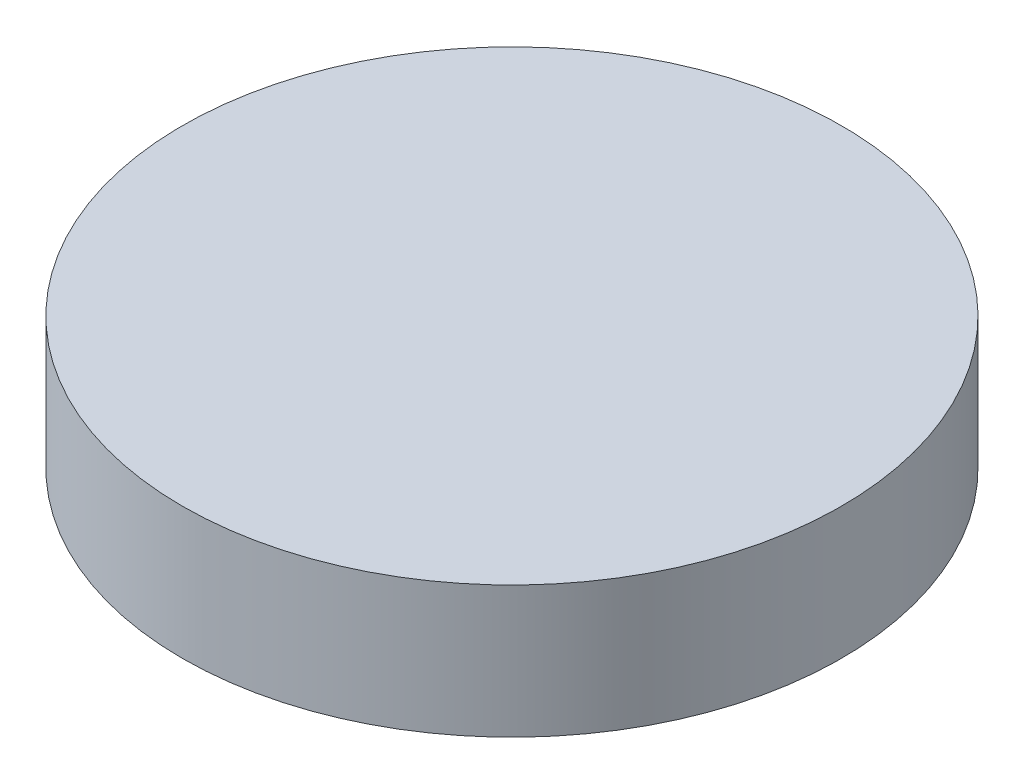
ISO-10303-21;
HEADER;
FILE_DESCRIPTION(('STEP AP214'),'2;1');
FILE_NAME('part.step','',(''),(''),'','','');
FILE_SCHEMA(('AUTOMOTIVE_DESIGN { 1 0 10303 214 1 1 1 1 }'));
ENDSEC;
DATA;
#1=APPLICATION_CONTEXT('core data for automotive mechanical design processes');
#2=APPLICATION_PROTOCOL_DEFINITION('international standard','automotive_design',2000,#1);
#3=PRODUCT_CONTEXT('',#1,'mechanical');
#4=PRODUCT('Part','Part','',(#3));
#5=PRODUCT_RELATED_PRODUCT_CATEGORY('part','',(#4));
#6=PRODUCT_DEFINITION_FORMATION('','',#4);
#7=PRODUCT_DEFINITION_CONTEXT('part definition',#1,'design');
#8=PRODUCT_DEFINITION('design','',#6,#7);
#9=PRODUCT_DEFINITION_SHAPE('','',#8);
#10=(LENGTH_UNIT() NAMED_UNIT(*) SI_UNIT(.MILLI.,.METRE.));
#11=(NAMED_UNIT(*) PLANE_ANGLE_UNIT() SI_UNIT($,.RADIAN.));
#12=(NAMED_UNIT(*) SI_UNIT($,.STERADIAN.) SOLID_ANGLE_UNIT());
#13=UNCERTAINTY_MEASURE_WITH_UNIT(LENGTH_MEASURE(1.E-05),#10,'distance_accuracy_value','');
#14=(GEOMETRIC_REPRESENTATION_CONTEXT(3) GLOBAL_UNCERTAINTY_ASSIGNED_CONTEXT((#13)) GLOBAL_UNIT_ASSIGNED_CONTEXT((#10,
#11,#12)) REPRESENTATION_CONTEXT('',''));
#15=CARTESIAN_POINT('',(0.,0.,0.));
#16=DIRECTION('',(0.,0.,1.));
#17=DIRECTION('',(1.,0.,0.));
#18=AXIS2_PLACEMENT_3D('',#15,#16,#17);
#19=CARTESIAN_POINT('',(0.,4.,0.));
#20=DIRECTION('',(0.,-1.,0.));
#21=DIRECTION('',(0.,0.,-1.));
#22=AXIS2_PLACEMENT_3D('',#19,#20,#21);
#23=CYLINDRICAL_SURFACE('',#22,10.);
#24=CARTESIAN_POINT('',(0.,4.,0.));
#25=DIRECTION('',(0.,1.,0.));
#26=DIRECTION('',(0.,0.,1.));
#27=AXIS2_PLACEMENT_3D('',#24,#25,#26);
#28=CIRCLE('',#27,10.);
#29=CARTESIAN_POINT('',(0.,4.,10.));
#30=VERTEX_POINT('',#29);
#31=EDGE_CURVE('E10',#30,#30,#28,.T.);
#32=ORIENTED_EDGE('',*,*,#31,.F.);
#33=EDGE_LOOP('',(#32));
#34=FACE_BOUND('',#33,.T.);
#35=CARTESIAN_POINT('',(0.,0.,0.));
#36=DIRECTION('',(0.,1.,0.));
#37=DIRECTION('',(0.,0.,1.));
#38=AXIS2_PLACEMENT_3D('',#35,#36,#37);
#39=CIRCLE('',#38,10.);
#40=CARTESIAN_POINT('',(0.,0.,10.));
#41=VERTEX_POINT('',#40);
#42=EDGE_CURVE('E35',#41,#41,#39,.T.);
#43=ORIENTED_EDGE('',*,*,#42,.T.);
#44=EDGE_LOOP('',(#43));
#45=FACE_BOUND('',#44,.T.);
#46=ADVANCED_FACE('F32',(#34,#45),#23,.T.);
#47=CARTESIAN_POINT('',(0.,4.,0.));
#48=DIRECTION('',(0.,1.,0.));
#49=DIRECTION('',(0.,0.,1.));
#50=AXIS2_PLACEMENT_3D('',#47,#48,#49);
#51=PLANE('',#50);
#52=ORIENTED_EDGE('',*,*,#31,.T.);
#53=EDGE_LOOP('',(#52));
#54=FACE_BOUND('',#53,.T.);
#55=ADVANCED_FACE('F47',(#54),#51,.T.);
#56=CARTESIAN_POINT('',(0.,0.,0.));
#57=DIRECTION('',(0.,1.,0.));
#58=DIRECTION('',(0.,0.,1.));
#59=AXIS2_PLACEMENT_3D('',#56,#57,#58);
#60=PLANE('',#59);
#61=ORIENTED_EDGE('',*,*,#42,.F.);
#62=EDGE_LOOP('',(#61));
#63=FACE_BOUND('',#62,.T.);
#64=ADVANCED_FACE('F45',(#63),#60,.F.);
#65=CLOSED_SHELL('',(#46,#55,#64));
#66=MANIFOLD_SOLID_BREP('B2',#65);
#67=ADVANCED_BREP_SHAPE_REPRESENTATION('',(#18,#66),#14);
#68=SHAPE_DEFINITION_REPRESENTATION(#9,#67);
ENDSEC;
END-ISO-10303-21;
